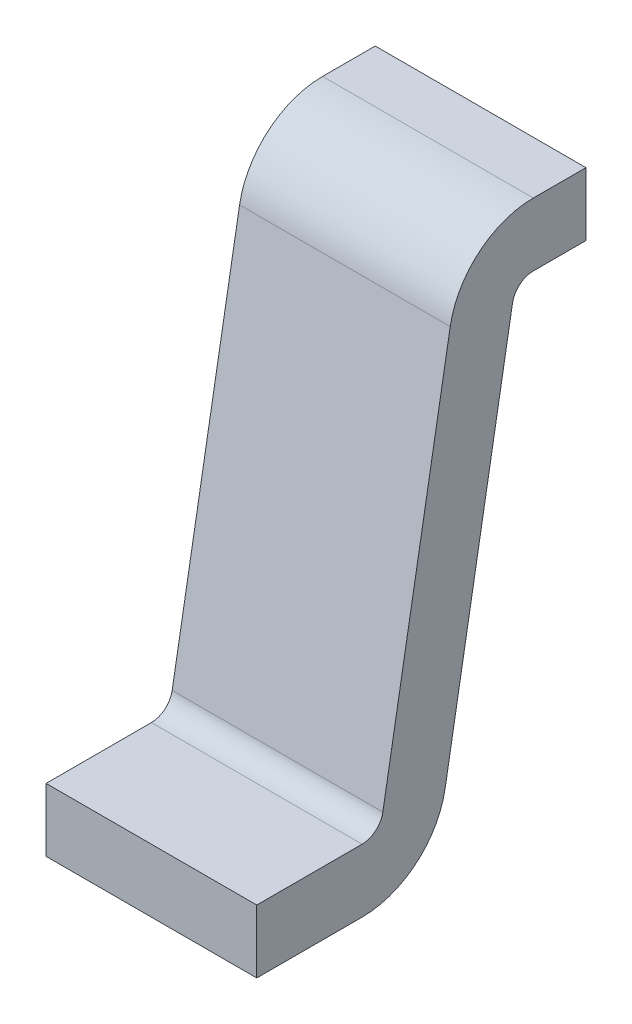
ISO-10303-21;
HEADER;
FILE_DESCRIPTION(('STEP AP214'),'2;1');
FILE_NAME('part.step','',(''),(''),'','','');
FILE_SCHEMA(('AUTOMOTIVE_DESIGN { 1 0 10303 214 1 1 1 1 }'));
ENDSEC;
DATA;
#1=APPLICATION_CONTEXT('core data for automotive mechanical design processes');
#2=APPLICATION_PROTOCOL_DEFINITION('international standard','automotive_design',2000,#1);
#3=PRODUCT_CONTEXT('',#1,'mechanical');
#4=PRODUCT('Part','Part','',(#3));
#5=PRODUCT_RELATED_PRODUCT_CATEGORY('part','',(#4));
#6=PRODUCT_DEFINITION_FORMATION('','',#4);
#7=PRODUCT_DEFINITION_CONTEXT('part definition',#1,'design');
#8=PRODUCT_DEFINITION('design','',#6,#7);
#9=PRODUCT_DEFINITION_SHAPE('','',#8);
#10=(LENGTH_UNIT() NAMED_UNIT(*) SI_UNIT(.MILLI.,.METRE.));
#11=(NAMED_UNIT(*) PLANE_ANGLE_UNIT() SI_UNIT($,.RADIAN.));
#12=(NAMED_UNIT(*) SI_UNIT($,.STERADIAN.) SOLID_ANGLE_UNIT());
#13=UNCERTAINTY_MEASURE_WITH_UNIT(LENGTH_MEASURE(1.E-05),#10,'distance_accuracy_value','');
#14=(GEOMETRIC_REPRESENTATION_CONTEXT(3) GLOBAL_UNCERTAINTY_ASSIGNED_CONTEXT((#13)) GLOBAL_UNIT_ASSIGNED_CONTEXT((#10,
#11,#12)) REPRESENTATION_CONTEXT('',''));
#15=CARTESIAN_POINT('',(0.,0.,0.));
#16=DIRECTION('',(0.,0.,1.));
#17=DIRECTION('',(1.,0.,0.));
#18=AXIS2_PLACEMENT_3D('',#15,#16,#17);
#19=CARTESIAN_POINT('',(-0.2,-0.09313287137827,0.139406123185));
#20=DIRECTION('',(0.,-0.171678215542962,-0.985153079631782));
#21=DIRECTION('',(0.,-0.985153079631782,0.171678215542962));
#22=AXIS2_PLACEMENT_3D('',#19,#20,#21);
#23=PLANE('',#22);
#24=DIRECTION('',(-1.,0.,0.));
#25=VECTOR('',#24,1.);
#26=CARTESIAN_POINT('',(-0.2,-0.827468514487,0.267375507259));
#27=LINE('',#26,#25);
#28=CARTESIAN_POINT('',(0.2,-0.827468514487,0.267375507259));
#29=VERTEX_POINT('',#28);
#30=CARTESIAN_POINT('',(-0.2,-0.827468514487,0.267375507259));
#31=VERTEX_POINT('',#30);
#32=EDGE_CURVE('E26',#29,#31,#27,.T.);
#33=ORIENTED_EDGE('',*,*,#32,.T.);
#34=DIRECTION('',(0.,0.985153079631782,-0.171678215542962));
#35=VECTOR('',#34,1.);
#36=CARTESIAN_POINT('',(-0.2,-0.09313287137827,0.139406123185));
#37=LINE('',#36,#35);
#38=CARTESIAN_POINT('',(-0.2,-0.09313287137827,0.139406123185));
#39=VERTEX_POINT('',#38);
#40=EDGE_CURVE('E11',#31,#39,#37,.T.);
#41=ORIENTED_EDGE('',*,*,#40,.T.);
#42=DIRECTION('',(1.,0.,0.));
#43=VECTOR('',#42,1.);
#44=CARTESIAN_POINT('',(-0.2,-0.09313287137827,0.139406123185));
#45=LINE('',#44,#43);
#46=CARTESIAN_POINT('',(0.2,-0.09313287137827,0.139406123185));
#47=VERTEX_POINT('',#46);
#48=EDGE_CURVE('E137',#39,#47,#45,.T.);
#49=ORIENTED_EDGE('',*,*,#48,.T.);
#50=DIRECTION('',(0.,-0.985153079631782,0.171678215542962));
#51=VECTOR('',#50,1.);
#52=CARTESIAN_POINT('',(0.2,-0.09313287137827,0.139406123185));
#53=LINE('',#52,#51);
#54=EDGE_CURVE('E129',#47,#29,#53,.T.);
#55=ORIENTED_EDGE('',*,*,#54,.T.);
#56=EDGE_LOOP('',(#33,#41,#49,#55));
#57=FACE_BOUND('',#56,.T.);
#58=ADVANCED_FACE('F16',(#57),#23,.T.);
#59=CARTESIAN_POINT('',(-0.2,-0.1,0.1));
#60=DIRECTION('',(1.,0.,0.));
#61=DIRECTION('',(0.,1.,0.));
#62=AXIS2_PLACEMENT_3D('',#59,#60,#61);
#63=PLANE('',#62);
#64=CARTESIAN_POINT('',(-0.2,-0.1,0.1));
#65=DIRECTION('',(-1.,0.,0.));
#66=DIRECTION('',(0.,0.,-1.));
#67=AXIS2_PLACEMENT_3D('',#64,#65,#66);
#68=CIRCLE('',#67,0.04);
#69=CARTESIAN_POINT('',(-0.2,-0.06,0.1));
#70=VERTEX_POINT('',#69);
#71=EDGE_CURVE('E134',#39,#70,#68,.T.);
#72=ORIENTED_EDGE('',*,*,#71,.F.);
#73=ORIENTED_EDGE('',*,*,#40,.F.);
#74=CARTESIAN_POINT('',(-0.2,-0.8,0.425));
#75=DIRECTION('',(1.,0.,0.));
#76=DIRECTION('',(0.,0.,-1.));
#77=AXIS2_PLACEMENT_3D('',#74,#75,#76);
#78=CIRCLE('',#77,0.16);
#79=CARTESIAN_POINT('',(-0.2,-0.96,0.425));
#80=VERTEX_POINT('',#79);
#81=EDGE_CURVE('E225',#80,#31,#78,.T.);
#82=ORIENTED_EDGE('',*,*,#81,.F.);
#83=DIRECTION('',(0.,0.,-1.));
#84=VECTOR('',#83,1.);
#85=CARTESIAN_POINT('',(-0.2,-0.96,0.1));
#86=LINE('',#85,#84);
#87=CARTESIAN_POINT('',(-0.2,-0.96,0.625));
#88=VERTEX_POINT('',#87);
#89=EDGE_CURVE('E161',#88,#80,#86,.T.);
#90=ORIENTED_EDGE('',*,*,#89,.F.);
#91=DIRECTION('',(0.,-1.,0.));
#92=VECTOR('',#91,1.);
#93=CARTESIAN_POINT('',(-0.2,-0.1,0.625));
#94=LINE('',#93,#92);
#95=CARTESIAN_POINT('',(-0.2,-0.84,0.625));
#96=VERTEX_POINT('',#95);
#97=EDGE_CURVE('E162',#96,#88,#94,.T.);
#98=ORIENTED_EDGE('',*,*,#97,.F.);
#99=DIRECTION('',(0.,0.,1.));
#100=VECTOR('',#99,1.);
#101=CARTESIAN_POINT('',(-0.2,-0.84,0.1));
#102=LINE('',#101,#100);
#103=CARTESIAN_POINT('',(-0.2,-0.84,0.425));
#104=VERTEX_POINT('',#103);
#105=EDGE_CURVE('E196',#104,#96,#102,.T.);
#106=ORIENTED_EDGE('',*,*,#105,.F.);
#107=CARTESIAN_POINT('',(-0.2,-0.8,0.425));
#108=DIRECTION('',(-1.,0.,0.));
#109=DIRECTION('',(0.,0.,-1.));
#110=AXIS2_PLACEMENT_3D('',#107,#108,#109);
#111=CIRCLE('',#110,0.04);
#112=CARTESIAN_POINT('',(-0.2,-0.806867128622,0.385593876815));
#113=VERTEX_POINT('',#112);
#114=EDGE_CURVE('E247',#113,#104,#111,.T.);
#115=ORIENTED_EDGE('',*,*,#114,.F.);
#116=DIRECTION('',(0.,-0.985153079631782,0.171678215542962));
#117=VECTOR('',#116,1.);
#118=CARTESIAN_POINT('',(-0.2,-0.07253148551307,0.257624492741));
#119=LINE('',#118,#117);
#120=CARTESIAN_POINT('',(-0.2,-0.07253148551307,0.257624492741));
#121=VERTEX_POINT('',#120);
#122=EDGE_CURVE('E206',#121,#113,#119,.T.);
#123=ORIENTED_EDGE('',*,*,#122,.F.);
#124=CARTESIAN_POINT('',(-0.2,-0.1,0.1));
#125=DIRECTION('',(1.,0.,0.));
#126=DIRECTION('',(0.,0.,-1.));
#127=AXIS2_PLACEMENT_3D('',#124,#125,#126);
#128=CIRCLE('',#127,0.16);
#129=CARTESIAN_POINT('',(-0.2,0.06,0.1));
#130=VERTEX_POINT('',#129);
#131=EDGE_CURVE('E190',#130,#121,#128,.T.);
#132=ORIENTED_EDGE('',*,*,#131,.F.);
#133=DIRECTION('',(0.,0.,1.));
#134=VECTOR('',#133,1.);
#135=CARTESIAN_POINT('',(-0.2,0.06,0.1));
#136=LINE('',#135,#134);
#137=CARTESIAN_POINT('',(-0.2,0.06,0.));
#138=VERTEX_POINT('',#137);
#139=EDGE_CURVE('E183',#138,#130,#136,.T.);
#140=ORIENTED_EDGE('',*,*,#139,.F.);
#141=DIRECTION('',(0.,1.,0.));
#142=VECTOR('',#141,1.);
#143=CARTESIAN_POINT('',(-0.2,-0.1,0.));
#144=LINE('',#143,#142);
#145=CARTESIAN_POINT('',(-0.2,-0.06,0.));
#146=VERTEX_POINT('',#145);
#147=EDGE_CURVE('E167',#146,#138,#144,.T.);
#148=ORIENTED_EDGE('',*,*,#147,.F.);
#149=DIRECTION('',(0.,0.,-1.));
#150=VECTOR('',#149,1.);
#151=CARTESIAN_POINT('',(-0.2,-0.06,0.1));
#152=LINE('',#151,#150);
#153=EDGE_CURVE('E152',#70,#146,#152,.T.);
#154=ORIENTED_EDGE('',*,*,#153,.F.);
#155=EDGE_LOOP('',(#72,#73,#82,#90,#98,#106,#115,#123,#132,#140,#148,#154));
#156=FACE_BOUND('',#155,.T.);
#157=ADVANCED_FACE('F295',(#156),#63,.F.);
#158=CARTESIAN_POINT('',(-0.2,-0.8,0.425));
#159=DIRECTION('',(1.,0.,0.));
#160=DIRECTION('',(0.,0.,-1.));
#161=AXIS2_PLACEMENT_3D('',#158,#159,#160);
#162=CYLINDRICAL_SURFACE('',#161,0.16);
#163=DIRECTION('',(-1.,0.,0.));
#164=VECTOR('',#163,1.);
#165=CARTESIAN_POINT('',(-0.2,-0.96,0.425));
#166=LINE('',#165,#164);
#167=CARTESIAN_POINT('',(0.2,-0.96,0.425));
#168=VERTEX_POINT('',#167);
#169=EDGE_CURVE('E252',#168,#80,#166,.T.);
#170=ORIENTED_EDGE('',*,*,#169,.T.);
#171=ORIENTED_EDGE('',*,*,#81,.T.);
#172=ORIENTED_EDGE('',*,*,#32,.F.);
#173=CARTESIAN_POINT('',(0.2,-0.8,0.425));
#174=DIRECTION('',(-1.,0.,0.));
#175=DIRECTION('',(0.,0.,-1.));
#176=AXIS2_PLACEMENT_3D('',#173,#174,#175);
#177=CIRCLE('',#176,0.16);
#178=EDGE_CURVE('E119',#29,#168,#177,.T.);
#179=ORIENTED_EDGE('',*,*,#178,.T.);
#180=EDGE_LOOP('',(#170,#171,#172,#179));
#181=FACE_BOUND('',#180,.T.);
#182=ADVANCED_FACE('F467',(#181),#162,.T.);
#183=CARTESIAN_POINT('',(0.2,-0.1,0.1));
#184=DIRECTION('',(1.,0.,0.));
#185=DIRECTION('',(0.,1.,0.));
#186=AXIS2_PLACEMENT_3D('',#183,#184,#185);
#187=PLANE('',#186);
#188=ORIENTED_EDGE('',*,*,#54,.F.);
#189=CARTESIAN_POINT('',(0.2,-0.1,0.1));
#190=DIRECTION('',(-1.,0.,0.));
#191=DIRECTION('',(0.,0.,-1.));
#192=AXIS2_PLACEMENT_3D('',#189,#190,#191);
#193=CIRCLE('',#192,0.04);
#194=CARTESIAN_POINT('',(0.2,-0.06,0.1));
#195=VERTEX_POINT('',#194);
#196=EDGE_CURVE('E107',#47,#195,#193,.T.);
#197=ORIENTED_EDGE('',*,*,#196,.T.);
#198=DIRECTION('',(0.,0.,-1.));
#199=VECTOR('',#198,1.);
#200=CARTESIAN_POINT('',(0.2,-0.06,0.1));
#201=LINE('',#200,#199);
#202=CARTESIAN_POINT('',(0.2,-0.06,0.));
#203=VERTEX_POINT('',#202);
#204=EDGE_CURVE('E146',#195,#203,#201,.T.);
#205=ORIENTED_EDGE('',*,*,#204,.T.);
#206=DIRECTION('',(0.,1.,0.));
#207=VECTOR('',#206,1.);
#208=CARTESIAN_POINT('',(0.2,-0.1,0.));
#209=LINE('',#208,#207);
#210=CARTESIAN_POINT('',(0.2,0.06,0.));
#211=VERTEX_POINT('',#210);
#212=EDGE_CURVE('E168',#203,#211,#209,.T.);
#213=ORIENTED_EDGE('',*,*,#212,.T.);
#214=DIRECTION('',(0.,0.,1.));
#215=VECTOR('',#214,1.);
#216=CARTESIAN_POINT('',(0.2,0.06,0.1));
#217=LINE('',#216,#215);
#218=CARTESIAN_POINT('',(0.2,0.06,0.1));
#219=VERTEX_POINT('',#218);
#220=EDGE_CURVE('E20',#211,#219,#217,.T.);
#221=ORIENTED_EDGE('',*,*,#220,.T.);
#222=CARTESIAN_POINT('',(0.2,-0.1,0.1));
#223=DIRECTION('',(1.,0.,0.));
#224=DIRECTION('',(0.,0.,-1.));
#225=AXIS2_PLACEMENT_3D('',#222,#223,#224);
#226=CIRCLE('',#225,0.16);
#227=CARTESIAN_POINT('',(0.2,-0.07253148551307,0.257624492741));
#228=VERTEX_POINT('',#227);
#229=EDGE_CURVE('E173',#219,#228,#226,.T.);
#230=ORIENTED_EDGE('',*,*,#229,.T.);
#231=DIRECTION('',(0.,-0.985153079631782,0.171678215542962));
#232=VECTOR('',#231,1.);
#233=CARTESIAN_POINT('',(0.2,-0.07253148551307,0.257624492741));
#234=LINE('',#233,#232);
#235=CARTESIAN_POINT('',(0.2,-0.806867128622,0.385593876815));
#236=VERTEX_POINT('',#235);
#237=EDGE_CURVE('E177',#228,#236,#234,.T.);
#238=ORIENTED_EDGE('',*,*,#237,.T.);
#239=CARTESIAN_POINT('',(0.2,-0.8,0.425));
#240=DIRECTION('',(-1.,0.,0.));
#241=DIRECTION('',(0.,0.,-1.));
#242=AXIS2_PLACEMENT_3D('',#239,#240,#241);
#243=CIRCLE('',#242,0.04);
#244=CARTESIAN_POINT('',(0.2,-0.84,0.425));
#245=VERTEX_POINT('',#244);
#246=EDGE_CURVE('E220',#236,#245,#243,.T.);
#247=ORIENTED_EDGE('',*,*,#246,.T.);
#248=DIRECTION('',(0.,0.,1.));
#249=VECTOR('',#248,1.);
#250=CARTESIAN_POINT('',(0.2,-0.84,0.1));
#251=LINE('',#250,#249);
#252=CARTESIAN_POINT('',(0.2,-0.84,0.625));
#253=VERTEX_POINT('',#252);
#254=EDGE_CURVE('E192',#245,#253,#251,.T.);
#255=ORIENTED_EDGE('',*,*,#254,.T.);
#256=DIRECTION('',(0.,-1.,0.));
#257=VECTOR('',#256,1.);
#258=CARTESIAN_POINT('',(0.2,-0.1,0.625));
#259=LINE('',#258,#257);
#260=CARTESIAN_POINT('',(0.2,-0.96,0.625));
#261=VERTEX_POINT('',#260);
#262=EDGE_CURVE('E182',#253,#261,#259,.T.);
#263=ORIENTED_EDGE('',*,*,#262,.T.);
#264=DIRECTION('',(0.,0.,-1.));
#265=VECTOR('',#264,1.);
#266=CARTESIAN_POINT('',(0.2,-0.96,0.1));
#267=LINE('',#266,#265);
#268=EDGE_CURVE('E259',#261,#168,#267,.T.);
#269=ORIENTED_EDGE('',*,*,#268,.T.);
#270=ORIENTED_EDGE('',*,*,#178,.F.);
#271=EDGE_LOOP('',(#188,#197,#205,#213,#221,#230,#238,#247,#255,#263,#269,#270));
#272=FACE_BOUND('',#271,.T.);
#273=ADVANCED_FACE('F131',(#272),#187,.T.);
#274=CARTESIAN_POINT('',(-0.2,-0.1,0.1));
#275=DIRECTION('',(1.,0.,0.));
#276=DIRECTION('',(0.,0.,-1.));
#277=AXIS2_PLACEMENT_3D('',#274,#275,#276);
#278=CYLINDRICAL_SURFACE('',#277,0.04);
#279=ORIENTED_EDGE('',*,*,#196,.F.);
#280=ORIENTED_EDGE('',*,*,#48,.F.);
#281=ORIENTED_EDGE('',*,*,#71,.T.);
#282=DIRECTION('',(-1.,0.,0.));
#283=VECTOR('',#282,1.);
#284=CARTESIAN_POINT('',(-0.2,-0.06,0.1));
#285=LINE('',#284,#283);
#286=EDGE_CURVE('E144',#195,#70,#285,.T.);
#287=ORIENTED_EDGE('',*,*,#286,.F.);
#288=EDGE_LOOP('',(#279,#280,#281,#287));
#289=FACE_BOUND('',#288,.T.);
#290=ADVANCED_FACE('F142',(#289),#278,.F.);
#291=CARTESIAN_POINT('',(-0.2,-0.06,0.1));
#292=DIRECTION('',(0.,-1.,0.));
#293=DIRECTION('',(0.,0.,-1.));
#294=AXIS2_PLACEMENT_3D('',#291,#292,#293);
#295=PLANE('',#294);
#296=ORIENTED_EDGE('',*,*,#286,.T.);
#297=ORIENTED_EDGE('',*,*,#153,.T.);
#298=DIRECTION('',(1.,0.,0.));
#299=VECTOR('',#298,1.);
#300=CARTESIAN_POINT('',(-0.2,-0.06,0.));
#301=LINE('',#300,#299);
#302=EDGE_CURVE('E163',#146,#203,#301,.T.);
#303=ORIENTED_EDGE('',*,*,#302,.T.);
#304=ORIENTED_EDGE('',*,*,#204,.F.);
#305=EDGE_LOOP('',(#296,#297,#303,#304));
#306=FACE_BOUND('',#305,.T.);
#307=ADVANCED_FACE('F299',(#306),#295,.T.);
#308=CARTESIAN_POINT('',(-0.2,-0.96,0.625));
#309=DIRECTION('',(0.,-1.,0.));
#310=DIRECTION('',(0.,0.,-1.));
#311=AXIS2_PLACEMENT_3D('',#308,#309,#310);
#312=PLANE('',#311);
#313=DIRECTION('',(-1.,0.,0.));
#314=VECTOR('',#313,1.);
#315=CARTESIAN_POINT('',(-0.2,-0.96,0.625));
#316=LINE('',#315,#314);
#317=EDGE_CURVE('E157',#261,#88,#316,.T.);
#318=ORIENTED_EDGE('',*,*,#317,.T.);
#319=ORIENTED_EDGE('',*,*,#89,.T.);
#320=ORIENTED_EDGE('',*,*,#169,.F.);
#321=ORIENTED_EDGE('',*,*,#268,.F.);
#322=EDGE_LOOP('',(#318,#319,#320,#321));
#323=FACE_BOUND('',#322,.T.);
#324=ADVANCED_FACE('F409',(#323),#312,.T.);
#325=CARTESIAN_POINT('',(-0.2,-0.96,0.625));
#326=DIRECTION('',(0.,0.,-1.));
#327=DIRECTION('',(0.,-1.,0.));
#328=AXIS2_PLACEMENT_3D('',#325,#326,#327);
#329=PLANE('',#328);
#330=ORIENTED_EDGE('',*,*,#262,.F.);
#331=DIRECTION('',(1.,0.,0.));
#332=VECTOR('',#331,1.);
#333=CARTESIAN_POINT('',(-0.2,-0.84,0.625));
#334=LINE('',#333,#332);
#335=EDGE_CURVE('E203',#96,#253,#334,.T.);
#336=ORIENTED_EDGE('',*,*,#335,.F.);
#337=ORIENTED_EDGE('',*,*,#97,.T.);
#338=ORIENTED_EDGE('',*,*,#317,.F.);
#339=EDGE_LOOP('',(#330,#336,#337,#338));
#340=FACE_BOUND('',#339,.T.);
#341=ADVANCED_FACE('F414',(#340),#329,.F.);
#342=CARTESIAN_POINT('',(-0.2,-0.84,0.625));
#343=DIRECTION('',(0.,-1.,0.));
#344=DIRECTION('',(0.,0.,-1.));
#345=AXIS2_PLACEMENT_3D('',#342,#343,#344);
#346=PLANE('',#345);
#347=ORIENTED_EDGE('',*,*,#254,.F.);
#348=DIRECTION('',(1.,0.,0.));
#349=VECTOR('',#348,1.);
#350=CARTESIAN_POINT('',(-0.2,-0.84,0.425));
#351=LINE('',#350,#349);
#352=EDGE_CURVE('E197',#104,#245,#351,.T.);
#353=ORIENTED_EDGE('',*,*,#352,.F.);
#354=ORIENTED_EDGE('',*,*,#105,.T.);
#355=ORIENTED_EDGE('',*,*,#335,.T.);
#356=EDGE_LOOP('',(#347,#353,#354,#355));
#357=FACE_BOUND('',#356,.T.);
#358=ADVANCED_FACE('F282',(#357),#346,.F.);
#359=CARTESIAN_POINT('',(-0.2,-0.8,0.425));
#360=DIRECTION('',(1.,0.,0.));
#361=DIRECTION('',(0.,0.,-1.));
#362=AXIS2_PLACEMENT_3D('',#359,#360,#361);
#363=CYLINDRICAL_SURFACE('',#362,0.04);
#364=ORIENTED_EDGE('',*,*,#246,.F.);
#365=DIRECTION('',(1.,0.,0.));
#366=VECTOR('',#365,1.);
#367=CARTESIAN_POINT('',(-0.2,-0.806867128622,0.385593876815));
#368=LINE('',#367,#366);
#369=EDGE_CURVE('E212',#113,#236,#368,.T.);
#370=ORIENTED_EDGE('',*,*,#369,.F.);
#371=ORIENTED_EDGE('',*,*,#114,.T.);
#372=ORIENTED_EDGE('',*,*,#352,.T.);
#373=EDGE_LOOP('',(#364,#370,#371,#372));
#374=FACE_BOUND('',#373,.T.);
#375=ADVANCED_FACE('F278',(#374),#363,.F.);
#376=CARTESIAN_POINT('',(-0.2,-0.07253148551307,0.257624492741));
#377=DIRECTION('',(0.,-0.171678215542962,-0.985153079631782));
#378=DIRECTION('',(0.,-0.985153079631782,0.171678215542962));
#379=AXIS2_PLACEMENT_3D('',#376,#377,#378);
#380=PLANE('',#379);
#381=ORIENTED_EDGE('',*,*,#237,.F.);
#382=DIRECTION('',(1.,0.,0.));
#383=VECTOR('',#382,1.);
#384=CARTESIAN_POINT('',(-0.2,-0.07253148551307,0.257624492741));
#385=LINE('',#384,#383);
#386=EDGE_CURVE('E178',#121,#228,#385,.T.);
#387=ORIENTED_EDGE('',*,*,#386,.F.);
#388=ORIENTED_EDGE('',*,*,#122,.T.);
#389=ORIENTED_EDGE('',*,*,#369,.T.);
#390=EDGE_LOOP('',(#381,#387,#388,#389));
#391=FACE_BOUND('',#390,.T.);
#392=ADVANCED_FACE('F18',(#391),#380,.F.);
#393=CARTESIAN_POINT('',(-0.2,-0.1,0.1));
#394=DIRECTION('',(1.,0.,0.));
#395=DIRECTION('',(0.,0.,-1.));
#396=AXIS2_PLACEMENT_3D('',#393,#394,#395);
#397=CYLINDRICAL_SURFACE('',#396,0.16);
#398=DIRECTION('',(-1.,0.,0.));
#399=VECTOR('',#398,1.);
#400=CARTESIAN_POINT('',(-0.2,0.06,0.1));
#401=LINE('',#400,#399);
#402=EDGE_CURVE('E187',#219,#130,#401,.T.);
#403=ORIENTED_EDGE('',*,*,#402,.T.);
#404=ORIENTED_EDGE('',*,*,#131,.T.);
#405=ORIENTED_EDGE('',*,*,#386,.T.);
#406=ORIENTED_EDGE('',*,*,#229,.F.);
#407=EDGE_LOOP('',(#403,#404,#405,#406));
#408=FACE_BOUND('',#407,.T.);
#409=ADVANCED_FACE('F401',(#408),#397,.T.);
#410=CARTESIAN_POINT('',(-0.2,0.06,0.1));
#411=DIRECTION('',(0.,-1.,0.));
#412=DIRECTION('',(0.,0.,-1.));
#413=AXIS2_PLACEMENT_3D('',#410,#411,#412);
#414=PLANE('',#413);
#415=ORIENTED_EDGE('',*,*,#220,.F.);
#416=DIRECTION('',(1.,0.,0.));
#417=VECTOR('',#416,1.);
#418=CARTESIAN_POINT('',(-0.2,0.06,0.));
#419=LINE('',#418,#417);
#420=EDGE_CURVE('E172',#138,#211,#419,.T.);
#421=ORIENTED_EDGE('',*,*,#420,.F.);
#422=ORIENTED_EDGE('',*,*,#139,.T.);
#423=ORIENTED_EDGE('',*,*,#402,.F.);
#424=EDGE_LOOP('',(#415,#421,#422,#423));
#425=FACE_BOUND('',#424,.T.);
#426=ADVANCED_FACE('F390',(#425),#414,.F.);
#427=CARTESIAN_POINT('',(-0.2,0.06,0.));
#428=DIRECTION('',(0.,0.,1.));
#429=DIRECTION('',(1.,0.,0.));
#430=AXIS2_PLACEMENT_3D('',#427,#428,#429);
#431=PLANE('',#430);
#432=ORIENTED_EDGE('',*,*,#212,.F.);
#433=ORIENTED_EDGE('',*,*,#302,.F.);
#434=ORIENTED_EDGE('',*,*,#147,.T.);
#435=ORIENTED_EDGE('',*,*,#420,.T.);
#436=EDGE_LOOP('',(#432,#433,#434,#435));
#437=FACE_BOUND('',#436,.T.);
#438=ADVANCED_FACE('F385',(#437),#431,.F.);
#439=CLOSED_SHELL('',(#58,#157,#182,#273,#290,#307,#324,#341,#358,#375,#392,#409,#426,#438));
#440=MANIFOLD_SOLID_BREP('B1',#439);
#441=ADVANCED_BREP_SHAPE_REPRESENTATION('',(#18,#440),#14);
#442=SHAPE_DEFINITION_REPRESENTATION(#9,#441);
ENDSEC;
END-ISO-10303-21;
